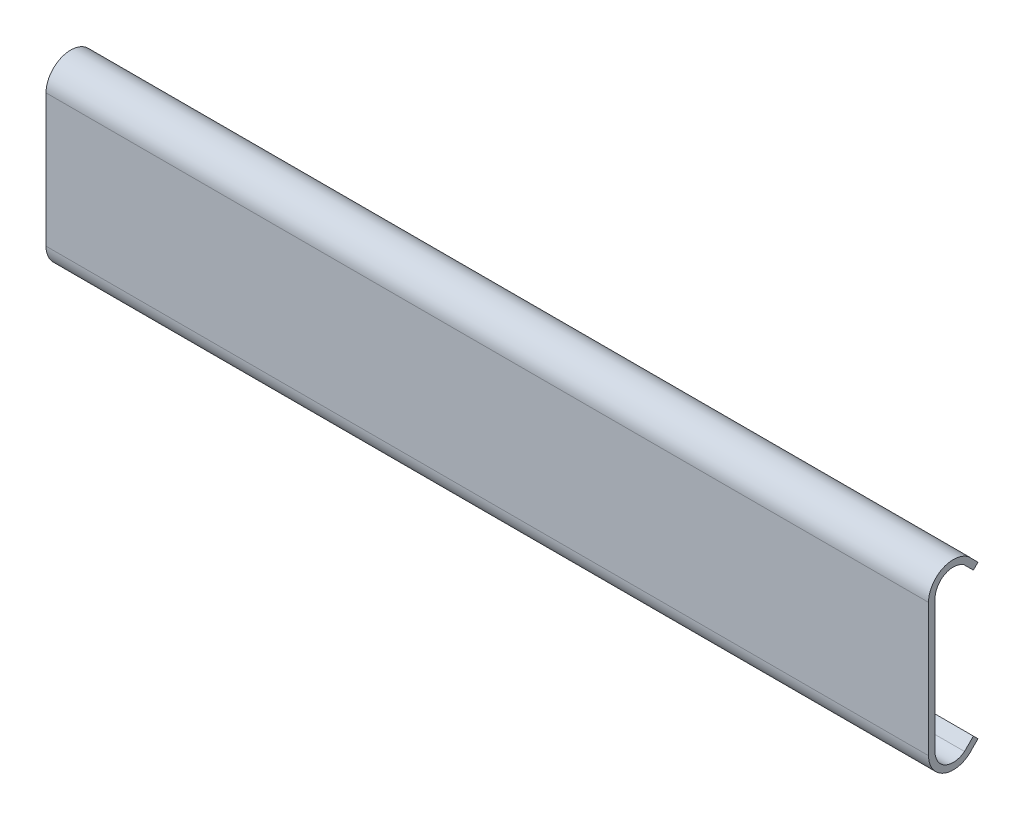
ISO-10303-21;
HEADER;
FILE_DESCRIPTION(('STEP AP214'),'2;1');
FILE_NAME('part.step','',(''),(''),'','','');
FILE_SCHEMA(('AUTOMOTIVE_DESIGN { 1 0 10303 214 1 1 1 1 }'));
ENDSEC;
DATA;
#1=APPLICATION_CONTEXT('core data for automotive mechanical design processes');
#2=APPLICATION_PROTOCOL_DEFINITION('international standard','automotive_design',2000,#1);
#3=PRODUCT_CONTEXT('',#1,'mechanical');
#4=PRODUCT('Part','Part','',(#3));
#5=PRODUCT_RELATED_PRODUCT_CATEGORY('part','',(#4));
#6=PRODUCT_DEFINITION_FORMATION('','',#4);
#7=PRODUCT_DEFINITION_CONTEXT('part definition',#1,'design');
#8=PRODUCT_DEFINITION('design','',#6,#7);
#9=PRODUCT_DEFINITION_SHAPE('','',#8);
#10=(LENGTH_UNIT() NAMED_UNIT(*) SI_UNIT(.MILLI.,.METRE.));
#11=(NAMED_UNIT(*) PLANE_ANGLE_UNIT() SI_UNIT($,.RADIAN.));
#12=(NAMED_UNIT(*) SI_UNIT($,.STERADIAN.) SOLID_ANGLE_UNIT());
#13=UNCERTAINTY_MEASURE_WITH_UNIT(LENGTH_MEASURE(1.E-05),#10,'distance_accuracy_value','');
#14=(GEOMETRIC_REPRESENTATION_CONTEXT(3) GLOBAL_UNCERTAINTY_ASSIGNED_CONTEXT((#13)) GLOBAL_UNIT_ASSIGNED_CONTEXT((#10,
#11,#12)) REPRESENTATION_CONTEXT('',''));
#15=CARTESIAN_POINT('',(0.,0.,0.));
#16=DIRECTION('',(0.,0.,1.));
#17=DIRECTION('',(1.,0.,0.));
#18=AXIS2_PLACEMENT_3D('',#15,#16,#17);
#19=CARTESIAN_POINT('',(-67.8,5.872424683223,-3.8));
#20=DIRECTION('',(0.,-0.707106781186548,-0.707106781186548));
#21=DIRECTION('',(0.,0.707106781186548,-0.707106781186548));
#22=AXIS2_PLACEMENT_3D('',#19,#20,#21);
#23=PLANE('',#22);
#24=DIRECTION('',(1.,0.,0.));
#25=VECTOR('',#24,1.);
#26=CARTESIAN_POINT('',(-67.8,5.8724246832225,-3.7999999999995));
#27=LINE('',#26,#25);
#28=CARTESIAN_POINT('',(0.,5.87242468322267,-3.79999999999967));
#29=VERTEX_POINT('',#28);
#30=CARTESIAN_POINT('',(-67.8,5.87242468322267,-3.79999999999967));
#31=VERTEX_POINT('',#30);
#32=EDGE_CURVE('E188',#29,#31,#27,.F.);
#33=ORIENTED_EDGE('',*,*,#32,.F.);
#34=DIRECTION('',(0.,0.707106781186548,-0.707106781186548));
#35=VECTOR('',#34,1.);
#36=CARTESIAN_POINT('',(0.,5.872424683223,-3.8));
#37=LINE('',#36,#35);
#38=CARTESIAN_POINT('',(0.,5.51887129262917,-3.44644660940683));
#39=VERTEX_POINT('',#38);
#40=EDGE_CURVE('E218',#29,#39,#37,.F.);
#41=ORIENTED_EDGE('',*,*,#40,.T.);
#42=DIRECTION('',(1.,0.,0.));
#43=VECTOR('',#42,1.);
#44=CARTESIAN_POINT('',(-67.8,5.518871292629,-3.446446609407));
#45=LINE('',#44,#43);
#46=CARTESIAN_POINT('',(-67.8,5.51887129262917,-3.44644660940683));
#47=VERTEX_POINT('',#46);
#48=EDGE_CURVE('E198',#47,#39,#45,.T.);
#49=ORIENTED_EDGE('',*,*,#48,.F.);
#50=DIRECTION('',(0.,0.707106781186548,-0.707106781186548));
#51=VECTOR('',#50,1.);
#52=CARTESIAN_POINT('',(-67.8,5.872424683223,-3.8));
#53=LINE('',#52,#51);
#54=EDGE_CURVE('E231',#47,#31,#53,.T.);
#55=ORIENTED_EDGE('',*,*,#54,.T.);
#56=EDGE_LOOP('',(#33,#41,#49,#55));
#57=FACE_BOUND('',#56,.T.);
#58=ADVANCED_FACE('F17',(#57),#23,.T.);
#59=CARTESIAN_POINT('',(-67.8,-5.872424683223,-3.8));
#60=DIRECTION('',(0.,0.707106781186548,-0.707106781186548));
#61=DIRECTION('',(0.,0.707106781186548,0.707106781186548));
#62=AXIS2_PLACEMENT_3D('',#59,#60,#61);
#63=PLANE('',#62);
#64=DIRECTION('',(1.,0.,0.));
#65=VECTOR('',#64,1.);
#66=CARTESIAN_POINT('',(-67.8,-5.518871292629,-3.446446609407));
#67=LINE('',#66,#65);
#68=CARTESIAN_POINT('',(0.,-5.51887129262917,-3.44644660940683));
#69=VERTEX_POINT('',#68);
#70=CARTESIAN_POINT('',(-67.8,-5.51887129262917,-3.44644660940683));
#71=VERTEX_POINT('',#70);
#72=EDGE_CURVE('E158',#69,#71,#67,.F.);
#73=ORIENTED_EDGE('',*,*,#72,.F.);
#74=DIRECTION('',(0.,0.707106781186548,0.707106781186548));
#75=VECTOR('',#74,1.);
#76=CARTESIAN_POINT('',(0.,-5.872424683223,-3.8));
#77=LINE('',#76,#75);
#78=CARTESIAN_POINT('',(0.,-5.87242468322267,-3.79999999999967));
#79=VERTEX_POINT('',#78);
#80=EDGE_CURVE('E204',#69,#79,#77,.F.);
#81=ORIENTED_EDGE('',*,*,#80,.T.);
#82=DIRECTION('',(1.,0.,0.));
#83=VECTOR('',#82,1.);
#84=CARTESIAN_POINT('',(-67.8,-5.8724246832225,-3.7999999999995));
#85=LINE('',#84,#83);
#86=CARTESIAN_POINT('',(-67.8,-5.87242468322267,-3.79999999999967));
#87=VERTEX_POINT('',#86);
#88=EDGE_CURVE('E168',#87,#79,#85,.T.);
#89=ORIENTED_EDGE('',*,*,#88,.F.);
#90=DIRECTION('',(0.,0.707106781186548,0.707106781186548));
#91=VECTOR('',#90,1.);
#92=CARTESIAN_POINT('',(-67.8,-5.872424683223,-3.8));
#93=LINE('',#92,#91);
#94=EDGE_CURVE('E213',#87,#71,#93,.T.);
#95=ORIENTED_EDGE('',*,*,#94,.T.);
#96=EDGE_LOOP('',(#73,#81,#89,#95));
#97=FACE_BOUND('',#96,.T.);
#98=ADVANCED_FACE('F330',(#97),#63,.T.);
#99=CARTESIAN_POINT('',(-67.8,6.284530895197,-2.680787006839));
#100=DIRECTION('',(0.,-0.707106781186548,0.707106781186548));
#101=DIRECTION('',(0.,-0.707106781186548,-0.707106781186548));
#102=AXIS2_PLACEMENT_3D('',#99,#100,#101);
#103=PLANE('',#102);
#104=ORIENTED_EDGE('',*,*,#48,.T.);
#105=DIRECTION('',(0.,-0.707106781186548,-0.707106781186548));
#106=VECTOR('',#105,1.);
#107=CARTESIAN_POINT('',(0.,6.284530895197,-2.680787006839));
#108=LINE('',#107,#106);
#109=CARTESIAN_POINT('',(0.,6.28453089519731,-2.68078700683914));
#110=VERTEX_POINT('',#109);
#111=EDGE_CURVE('E195',#39,#110,#108,.F.);
#112=ORIENTED_EDGE('',*,*,#111,.T.);
#113=DIRECTION('',(1.,0.,0.));
#114=VECTOR('',#113,1.);
#115=CARTESIAN_POINT('',(-67.8,6.28453089519746,-2.68078700683921));
#116=LINE('',#115,#114);
#117=CARTESIAN_POINT('',(-67.8,6.28453089519735,-2.6807870068391));
#118=VERTEX_POINT('',#117);
#119=EDGE_CURVE('E147',#118,#110,#116,.T.);
#120=ORIENTED_EDGE('',*,*,#119,.F.);
#121=DIRECTION('',(0.,-0.707106781186548,-0.707106781186548));
#122=VECTOR('',#121,1.);
#123=CARTESIAN_POINT('',(-67.8,6.284530895197,-2.680787006839));
#124=LINE('',#123,#122);
#125=EDGE_CURVE('E201',#118,#47,#124,.T.);
#126=ORIENTED_EDGE('',*,*,#125,.T.);
#127=EDGE_LOOP('',(#104,#112,#120,#126));
#128=FACE_BOUND('',#127,.T.);
#129=ADVANCED_FACE('F342',(#128),#103,.T.);
#130=CARTESIAN_POINT('',(-67.8,6.436212341611,-3.236212341611));
#131=DIRECTION('',(0.,0.707106781186548,-0.707106781186548));
#132=DIRECTION('',(0.,0.707106781186548,0.707106781186548));
#133=AXIS2_PLACEMENT_3D('',#130,#131,#132);
#134=PLANE('',#133);
#135=DIRECTION('',(1.,0.,0.));
#136=VECTOR('',#135,1.);
#137=CARTESIAN_POINT('',(-67.8,6.436212341611,-3.236212341611));
#138=LINE('',#137,#136);
#139=CARTESIAN_POINT('',(0.,6.436212341611,-3.236212341611));
#140=VERTEX_POINT('',#139);
#141=CARTESIAN_POINT('',(-67.8,6.436212341611,-3.236212341611));
#142=VERTEX_POINT('',#141);
#143=EDGE_CURVE('E141',#140,#142,#138,.F.);
#144=ORIENTED_EDGE('',*,*,#143,.F.);
#145=DIRECTION('',(0.,0.707106781186548,0.707106781186548));
#146=VECTOR('',#145,1.);
#147=CARTESIAN_POINT('',(0.,6.436212341611,-3.236212341611));
#148=LINE('',#147,#146);
#149=EDGE_CURVE('E169',#140,#29,#148,.F.);
#150=ORIENTED_EDGE('',*,*,#149,.T.);
#151=ORIENTED_EDGE('',*,*,#32,.T.);
#152=DIRECTION('',(0.,0.707106781186548,0.707106781186548));
#153=VECTOR('',#152,1.);
#154=CARTESIAN_POINT('',(-67.8,6.436212341611,-3.236212341611));
#155=LINE('',#154,#153);
#156=EDGE_CURVE('E183',#31,#142,#155,.T.);
#157=ORIENTED_EDGE('',*,*,#156,.T.);
#158=EDGE_LOOP('',(#144,#150,#151,#157));
#159=FACE_BOUND('',#158,.T.);
#160=ADVANCED_FACE('F321',(#159),#134,.T.);
#161=CARTESIAN_POINT('',(-67.8,-6.436212341611,-3.236212341611));
#162=DIRECTION('',(0.,-0.707106781186548,-0.707106781186548));
#163=DIRECTION('',(0.,0.707106781186548,-0.707106781186548));
#164=AXIS2_PLACEMENT_3D('',#161,#162,#163);
#165=PLANE('',#164);
#166=ORIENTED_EDGE('',*,*,#88,.T.);
#167=DIRECTION('',(0.,0.707106781186548,-0.707106781186548));
#168=VECTOR('',#167,1.);
#169=CARTESIAN_POINT('',(0.,-6.436212341611,-3.236212341611));
#170=LINE('',#169,#168);
#171=CARTESIAN_POINT('',(0.,-6.436212341611,-3.236212341611));
#172=VERTEX_POINT('',#171);
#173=EDGE_CURVE('E172',#79,#172,#170,.F.);
#174=ORIENTED_EDGE('',*,*,#173,.T.);
#175=DIRECTION('',(1.,0.,0.));
#176=VECTOR('',#175,1.);
#177=CARTESIAN_POINT('',(-67.8,-6.436212341611,-3.236212341611));
#178=LINE('',#177,#176);
#179=CARTESIAN_POINT('',(-67.8,-6.436212341611,-3.236212341611));
#180=VERTEX_POINT('',#179);
#181=EDGE_CURVE('E125',#180,#172,#178,.T.);
#182=ORIENTED_EDGE('',*,*,#181,.F.);
#183=DIRECTION('',(0.,0.707106781186548,-0.707106781186548));
#184=VECTOR('',#183,1.);
#185=CARTESIAN_POINT('',(-67.8,-6.436212341611,-3.236212341611));
#186=LINE('',#185,#184);
#187=EDGE_CURVE('E165',#180,#87,#186,.T.);
#188=ORIENTED_EDGE('',*,*,#187,.T.);
#189=EDGE_LOOP('',(#166,#174,#182,#188));
#190=FACE_BOUND('',#189,.T.);
#191=ADVANCED_FACE('F332',(#190),#165,.T.);
#192=CARTESIAN_POINT('',(-67.8,-5.518871292629,-3.446446609407));
#193=DIRECTION('',(0.,0.707106781186548,0.707106781186548));
#194=DIRECTION('',(0.,-0.707106781186548,0.707106781186548));
#195=AXIS2_PLACEMENT_3D('',#192,#193,#194);
#196=PLANE('',#195);
#197=DIRECTION('',(-1.,0.,0.));
#198=VECTOR('',#197,1.);
#199=CARTESIAN_POINT('',(-67.8,-6.20258136753812,-2.76273653449809));
#200=LINE('',#199,#198);
#201=CARTESIAN_POINT('',(-67.8,-6.20258136753849,-2.76273653449761));
#202=VERTEX_POINT('',#201);
#203=CARTESIAN_POINT('',(0.,-6.20258136753849,-2.76273653449761));
#204=VERTEX_POINT('',#203);
#205=EDGE_CURVE('E115',#202,#204,#200,.F.);
#206=ORIENTED_EDGE('',*,*,#205,.T.);
#207=DIRECTION('',(0.,-0.707106781186548,0.707106781186548));
#208=VECTOR('',#207,1.);
#209=CARTESIAN_POINT('',(0.,-5.518871292629,-3.446446609407));
#210=LINE('',#209,#208);
#211=EDGE_CURVE('E148',#204,#69,#210,.F.);
#212=ORIENTED_EDGE('',*,*,#211,.T.);
#213=ORIENTED_EDGE('',*,*,#72,.T.);
#214=DIRECTION('',(0.,-0.707106781186548,0.707106781186548));
#215=VECTOR('',#214,1.);
#216=CARTESIAN_POINT('',(-67.8,-5.518871292629,-3.446446609407));
#217=LINE('',#216,#215);
#218=EDGE_CURVE('E156',#71,#202,#217,.T.);
#219=ORIENTED_EDGE('',*,*,#218,.T.);
#220=EDGE_LOOP('',(#206,#212,#213,#219));
#221=FACE_BOUND('',#220,.T.);
#222=ADVANCED_FACE('F293',(#221),#196,.T.);
#223=CARTESIAN_POINT('',(-67.8,6.378215491039,-2.471108709852));
#224=DIRECTION('',(0.,-0.913011065027581,0.407934792751492));
#225=DIRECTION('',(0.,-0.407934792751492,-0.913011065027581));
#226=AXIS2_PLACEMENT_3D('',#223,#224,#225);
#227=PLANE('',#226);
#228=ORIENTED_EDGE('',*,*,#119,.T.);
#229=DIRECTION('',(0.,-0.407934792751492,-0.913011065027581));
#230=VECTOR('',#229,1.);
#231=CARTESIAN_POINT('',(0.,6.378215491039,-2.471108709852));
#232=LINE('',#231,#230);
#233=CARTESIAN_POINT('',(0.,6.37821549103881,-2.47110870985204));
#234=VERTEX_POINT('',#233);
#235=EDGE_CURVE('E151',#110,#234,#232,.F.);
#236=ORIENTED_EDGE('',*,*,#235,.T.);
#237=DIRECTION('',(-1.,0.,0.));
#238=VECTOR('',#237,1.);
#239=CARTESIAN_POINT('',(-67.8,6.37821549103871,-2.47110870985187));
#240=LINE('',#239,#238);
#241=CARTESIAN_POINT('',(-67.8,6.37821549103881,-2.47110870985204));
#242=VERTEX_POINT('',#241);
#243=EDGE_CURVE('E111',#234,#242,#240,.T.);
#244=ORIENTED_EDGE('',*,*,#243,.T.);
#245=DIRECTION('',(0.,-0.407934792751492,-0.913011065027581));
#246=VECTOR('',#245,1.);
#247=CARTESIAN_POINT('',(-67.8,6.378215491039,-2.471108709852));
#248=LINE('',#247,#246);
#249=EDGE_CURVE('E144',#242,#118,#248,.T.);
#250=ORIENTED_EDGE('',*,*,#249,.T.);
#251=EDGE_LOOP('',(#228,#236,#244,#250));
#252=FACE_BOUND('',#251,.T.);
#253=ADVANCED_FACE('F340',(#252),#227,.T.);
#254=CARTESIAN_POINT('',(-67.8,6.436212341611,-3.236212341611));
#255=DIRECTION('',(0.,-0.707106781186598,-0.707106781186498));
#256=DIRECTION('',(0.,0.707106781186498,-0.707106781186598));
#257=AXIS2_PLACEMENT_3D('',#254,#255,#256);
#258=PLANE('',#257);
#259=DIRECTION('',(-1.,0.,0.));
#260=VECTOR('',#259,1.);
#261=CARTESIAN_POINT('',(-67.8,6.44350288425444,-3.24350288425444));
#262=LINE('',#261,#260);
#263=CARTESIAN_POINT('',(0.,6.44350288425444,-3.24350288425444));
#264=VERTEX_POINT('',#263);
#265=CARTESIAN_POINT('',(-67.8,6.44350288425444,-3.24350288425444));
#266=VERTEX_POINT('',#265);
#267=EDGE_CURVE('E79',#264,#266,#262,.T.);
#268=ORIENTED_EDGE('',*,*,#267,.F.);
#269=DIRECTION('',(0.,0.707106781186498,-0.707106781186598));
#270=VECTOR('',#269,1.);
#271=CARTESIAN_POINT('',(0.,6.436212341611,-3.236212341611));
#272=LINE('',#271,#270);
#273=EDGE_CURVE('E132',#264,#140,#272,.F.);
#274=ORIENTED_EDGE('',*,*,#273,.T.);
#275=ORIENTED_EDGE('',*,*,#143,.T.);
#276=DIRECTION('',(0.,0.707106781186498,-0.707106781186598));
#277=VECTOR('',#276,1.);
#278=CARTESIAN_POINT('',(-67.8,6.436212341611,-3.236212341611));
#279=LINE('',#278,#277);
#280=EDGE_CURVE('E137',#142,#266,#279,.T.);
#281=ORIENTED_EDGE('',*,*,#280,.T.);
#282=EDGE_LOOP('',(#268,#274,#275,#281));
#283=FACE_BOUND('',#282,.T.);
#284=ADVANCED_FACE('F365',(#283),#258,.T.);
#285=CARTESIAN_POINT('',(-67.8,-6.436212341611,-3.236212341611));
#286=DIRECTION('',(0.,0.707106781186598,-0.707106781186498));
#287=DIRECTION('',(0.,0.707106781186498,0.707106781186598));
#288=AXIS2_PLACEMENT_3D('',#285,#286,#287);
#289=PLANE('',#288);
#290=ORIENTED_EDGE('',*,*,#181,.T.);
#291=DIRECTION('',(0.,0.707106781186498,0.707106781186598));
#292=VECTOR('',#291,1.);
#293=CARTESIAN_POINT('',(0.,-6.436212341611,-3.236212341611));
#294=LINE('',#293,#292);
#295=CARTESIAN_POINT('',(0.,-6.44350288425444,-3.24350288425444));
#296=VERTEX_POINT('',#295);
#297=EDGE_CURVE('E118',#172,#296,#294,.F.);
#298=ORIENTED_EDGE('',*,*,#297,.T.);
#299=DIRECTION('',(-1.,0.,0.));
#300=VECTOR('',#299,1.);
#301=CARTESIAN_POINT('',(-67.8,-6.44350288425444,-3.24350288425444));
#302=LINE('',#301,#300);
#303=CARTESIAN_POINT('',(-67.8,-6.44350288425444,-3.24350288425444));
#304=VERTEX_POINT('',#303);
#305=EDGE_CURVE('E119',#304,#296,#302,.F.);
#306=ORIENTED_EDGE('',*,*,#305,.F.);
#307=DIRECTION('',(0.,0.707106781186548,0.707106781186548));
#308=VECTOR('',#307,1.);
#309=CARTESIAN_POINT('',(-67.8,-6.443502884254,-3.243502884254));
#310=LINE('',#309,#308);
#311=EDGE_CURVE('E82',#304,#180,#310,.T.);
#312=ORIENTED_EDGE('',*,*,#311,.T.);
#313=EDGE_LOOP('',(#290,#298,#306,#312));
#314=FACE_BOUND('',#313,.T.);
#315=ADVANCED_FACE('F278',(#314),#289,.T.);
#316=CARTESIAN_POINT('',(-67.8,-5.1,-1.9));
#317=DIRECTION('',(-1.,0.,0.));
#318=DIRECTION('',(0.,0.,1.));
#319=AXIS2_PLACEMENT_3D('',#316,#317,#318);
#320=CYLINDRICAL_SURFACE('',#319,1.4);
#321=ORIENTED_EDGE('',*,*,#205,.F.);
#322=CARTESIAN_POINT('',(-67.8,-5.1,-1.9));
#323=DIRECTION('',(-1.,0.,0.));
#324=DIRECTION('',(0.,0.,1.));
#325=AXIS2_PLACEMENT_3D('',#322,#323,#324);
#326=CIRCLE('',#325,1.4);
#327=CARTESIAN_POINT('',(-67.8,-5.1,-0.5));
#328=VERTEX_POINT('',#327);
#329=EDGE_CURVE('E103',#202,#328,#326,.T.);
#330=ORIENTED_EDGE('',*,*,#329,.T.);
#331=DIRECTION('',(-1.,0.,0.));
#332=VECTOR('',#331,1.);
#333=CARTESIAN_POINT('',(-67.8,-5.1,-0.5));
#334=LINE('',#333,#332);
#335=CARTESIAN_POINT('',(0.,-5.1,-0.5));
#336=VERTEX_POINT('',#335);
#337=EDGE_CURVE('E112',#336,#328,#334,.T.);
#338=ORIENTED_EDGE('',*,*,#337,.F.);
#339=CARTESIAN_POINT('',(0.,-5.1,-1.9));
#340=DIRECTION('',(-1.,0.,0.));
#341=DIRECTION('',(0.,0.,1.));
#342=AXIS2_PLACEMENT_3D('',#339,#340,#341);
#343=CIRCLE('',#342,1.4);
#344=EDGE_CURVE('E242',#204,#336,#343,.T.);
#345=ORIENTED_EDGE('',*,*,#344,.F.);
#346=EDGE_LOOP('',(#321,#330,#338,#345));
#347=FACE_BOUND('',#346,.T.);
#348=ADVANCED_FACE('F253',(#347),#320,.F.);
#349=CARTESIAN_POINT('',(-67.8,-5.1,-0.5));
#350=DIRECTION('',(0.,0.,-1.));
#351=DIRECTION('',(-1.,0.,0.));
#352=AXIS2_PLACEMENT_3D('',#349,#350,#351);
#353=PLANE('',#352);
#354=DIRECTION('',(-1.,0.,0.));
#355=VECTOR('',#354,1.);
#356=CARTESIAN_POINT('',(-67.8,5.1,-0.5));
#357=LINE('',#356,#355);
#358=CARTESIAN_POINT('',(-67.8,5.1,-0.5));
#359=VERTEX_POINT('',#358);
#360=CARTESIAN_POINT('',(0.,5.1,-0.5));
#361=VERTEX_POINT('',#360);
#362=EDGE_CURVE('E108',#359,#361,#357,.F.);
#363=ORIENTED_EDGE('',*,*,#362,.T.);
#364=DIRECTION('',(0.,1.,0.));
#365=VECTOR('',#364,1.);
#366=CARTESIAN_POINT('',(0.,5.1,-0.5));
#367=LINE('',#366,#365);
#368=EDGE_CURVE('E96',#336,#361,#367,.T.);
#369=ORIENTED_EDGE('',*,*,#368,.F.);
#370=ORIENTED_EDGE('',*,*,#337,.T.);
#371=DIRECTION('',(0.,1.,0.));
#372=VECTOR('',#371,1.);
#373=CARTESIAN_POINT('',(-67.8,5.1,-0.5));
#374=LINE('',#373,#372);
#375=EDGE_CURVE('E100',#328,#359,#374,.T.);
#376=ORIENTED_EDGE('',*,*,#375,.T.);
#377=EDGE_LOOP('',(#363,#369,#370,#376));
#378=FACE_BOUND('',#377,.T.);
#379=ADVANCED_FACE('F260',(#378),#353,.T.);
#380=CARTESIAN_POINT('',(-67.8,5.1,-1.9));
#381=DIRECTION('',(-1.,0.,0.));
#382=DIRECTION('',(0.,0.,1.));
#383=AXIS2_PLACEMENT_3D('',#380,#381,#382);
#384=CYLINDRICAL_SURFACE('',#383,1.4);
#385=ORIENTED_EDGE('',*,*,#362,.F.);
#386=CARTESIAN_POINT('',(-67.8,5.1,-1.9));
#387=DIRECTION('',(-1.,0.,0.));
#388=DIRECTION('',(0.,0.,1.));
#389=AXIS2_PLACEMENT_3D('',#386,#387,#388);
#390=CIRCLE('',#389,1.4);
#391=EDGE_CURVE('E102',#359,#242,#390,.T.);
#392=ORIENTED_EDGE('',*,*,#391,.T.);
#393=ORIENTED_EDGE('',*,*,#243,.F.);
#394=CARTESIAN_POINT('',(0.,5.1,-1.9));
#395=DIRECTION('',(-1.,0.,0.));
#396=DIRECTION('',(0.,0.,1.));
#397=AXIS2_PLACEMENT_3D('',#394,#395,#396);
#398=CIRCLE('',#397,1.4);
#399=EDGE_CURVE('E93',#361,#234,#398,.T.);
#400=ORIENTED_EDGE('',*,*,#399,.F.);
#401=EDGE_LOOP('',(#385,#392,#393,#400));
#402=FACE_BOUND('',#401,.T.);
#403=ADVANCED_FACE('F266',(#402),#384,.F.);
#404=CARTESIAN_POINT('',(-67.8,5.1,-1.9));
#405=DIRECTION('',(-1.,0.,0.));
#406=DIRECTION('',(0.,0.,1.));
#407=AXIS2_PLACEMENT_3D('',#404,#405,#406);
#408=CYLINDRICAL_SURFACE('',#407,1.9);
#409=DIRECTION('',(1.,0.,0.));
#410=VECTOR('',#409,1.);
#411=CARTESIAN_POINT('',(-67.8,5.1,0.));
#412=LINE('',#411,#410);
#413=CARTESIAN_POINT('',(0.,5.1,0.));
#414=VERTEX_POINT('',#413);
#415=CARTESIAN_POINT('',(-67.8,5.1,0.));
#416=VERTEX_POINT('',#415);
#417=EDGE_CURVE('E76',#414,#416,#412,.F.);
#418=ORIENTED_EDGE('',*,*,#417,.F.);
#419=CARTESIAN_POINT('',(0.,5.1,-1.9));
#420=DIRECTION('',(-1.,0.,0.));
#421=DIRECTION('',(0.,0.,1.));
#422=AXIS2_PLACEMENT_3D('',#419,#420,#421);
#423=CIRCLE('',#422,1.9);
#424=EDGE_CURVE('E121',#264,#414,#423,.F.);
#425=ORIENTED_EDGE('',*,*,#424,.F.);
#426=ORIENTED_EDGE('',*,*,#267,.T.);
#427=CARTESIAN_POINT('',(-67.8,5.1,-1.9));
#428=DIRECTION('',(-1.,0.,0.));
#429=DIRECTION('',(0.,0.,1.));
#430=AXIS2_PLACEMENT_3D('',#427,#428,#429);
#431=CIRCLE('',#430,1.9);
#432=EDGE_CURVE('E20',#266,#416,#431,.F.);
#433=ORIENTED_EDGE('',*,*,#432,.T.);
#434=EDGE_LOOP('',(#418,#425,#426,#433));
#435=FACE_BOUND('',#434,.T.);
#436=ADVANCED_FACE('F74',(#435),#408,.T.);
#437=CARTESIAN_POINT('',(-67.8,5.1,-1.9));
#438=DIRECTION('',(1.,0.,0.));
#439=DIRECTION('',(0.,0.,-1.));
#440=AXIS2_PLACEMENT_3D('',#437,#438,#439);
#441=PLANE('',#440);
#442=ORIENTED_EDGE('',*,*,#125,.F.);
#443=ORIENTED_EDGE('',*,*,#249,.F.);
#444=ORIENTED_EDGE('',*,*,#391,.F.);
#445=ORIENTED_EDGE('',*,*,#375,.F.);
#446=ORIENTED_EDGE('',*,*,#329,.F.);
#447=ORIENTED_EDGE('',*,*,#218,.F.);
#448=ORIENTED_EDGE('',*,*,#94,.F.);
#449=ORIENTED_EDGE('',*,*,#187,.F.);
#450=ORIENTED_EDGE('',*,*,#311,.F.);
#451=CARTESIAN_POINT('',(-67.8,-5.1,-1.9));
#452=DIRECTION('',(-1.,0.,0.));
#453=DIRECTION('',(0.,0.,1.));
#454=AXIS2_PLACEMENT_3D('',#451,#452,#453);
#455=CIRCLE('',#454,1.9);
#456=CARTESIAN_POINT('',(-67.8,-5.1,0.));
#457=VERTEX_POINT('',#456);
#458=EDGE_CURVE('E88',#457,#304,#455,.F.);
#459=ORIENTED_EDGE('',*,*,#458,.F.);
#460=DIRECTION('',(0.,1.,0.));
#461=VECTOR('',#460,1.);
#462=CARTESIAN_POINT('',(-67.8,-5.1,0.));
#463=LINE('',#462,#461);
#464=EDGE_CURVE('E84',#416,#457,#463,.F.);
#465=ORIENTED_EDGE('',*,*,#464,.F.);
#466=ORIENTED_EDGE('',*,*,#432,.F.);
#467=ORIENTED_EDGE('',*,*,#280,.F.);
#468=ORIENTED_EDGE('',*,*,#156,.F.);
#469=ORIENTED_EDGE('',*,*,#54,.F.);
#470=EDGE_LOOP('',(#442,#443,#444,#445,#446,#447,#448,#449,#450,#459,#465,#466,#467,#468,#469));
#471=FACE_BOUND('',#470,.T.);
#472=ADVANCED_FACE('F86',(#471),#441,.F.);
#473=CARTESIAN_POINT('',(-67.8,-5.1,-1.9));
#474=DIRECTION('',(-1.,0.,0.));
#475=DIRECTION('',(0.,0.,1.));
#476=AXIS2_PLACEMENT_3D('',#473,#474,#475);
#477=CYLINDRICAL_SURFACE('',#476,1.9);
#478=ORIENTED_EDGE('',*,*,#305,.T.);
#479=CARTESIAN_POINT('',(0.,-5.1,-1.9));
#480=DIRECTION('',(-1.,0.,0.));
#481=DIRECTION('',(0.,0.,1.));
#482=AXIS2_PLACEMENT_3D('',#479,#480,#481);
#483=CIRCLE('',#482,1.9);
#484=CARTESIAN_POINT('',(0.,-5.1,0.));
#485=VERTEX_POINT('',#484);
#486=EDGE_CURVE('E35',#485,#296,#483,.F.);
#487=ORIENTED_EDGE('',*,*,#486,.F.);
#488=DIRECTION('',(1.,0.,0.));
#489=VECTOR('',#488,1.);
#490=CARTESIAN_POINT('',(-67.8,-5.1,0.));
#491=LINE('',#490,#489);
#492=EDGE_CURVE('E26',#457,#485,#491,.T.);
#493=ORIENTED_EDGE('',*,*,#492,.F.);
#494=ORIENTED_EDGE('',*,*,#458,.T.);
#495=EDGE_LOOP('',(#478,#487,#493,#494));
#496=FACE_BOUND('',#495,.T.);
#497=ADVANCED_FACE('F283',(#496),#477,.T.);
#498=CARTESIAN_POINT('',(0.,5.1,-1.9));
#499=DIRECTION('',(1.,0.,0.));
#500=DIRECTION('',(0.,0.,-1.));
#501=AXIS2_PLACEMENT_3D('',#498,#499,#500);
#502=PLANE('',#501);
#503=ORIENTED_EDGE('',*,*,#40,.F.);
#504=ORIENTED_EDGE('',*,*,#149,.F.);
#505=ORIENTED_EDGE('',*,*,#273,.F.);
#506=ORIENTED_EDGE('',*,*,#424,.T.);
#507=DIRECTION('',(0.,1.,0.));
#508=VECTOR('',#507,1.);
#509=CARTESIAN_POINT('',(0.,-5.1,0.));
#510=LINE('',#509,#508);
#511=EDGE_CURVE('E11',#485,#414,#510,.T.);
#512=ORIENTED_EDGE('',*,*,#511,.F.);
#513=ORIENTED_EDGE('',*,*,#486,.T.);
#514=ORIENTED_EDGE('',*,*,#297,.F.);
#515=ORIENTED_EDGE('',*,*,#173,.F.);
#516=ORIENTED_EDGE('',*,*,#80,.F.);
#517=ORIENTED_EDGE('',*,*,#211,.F.);
#518=ORIENTED_EDGE('',*,*,#344,.T.);
#519=ORIENTED_EDGE('',*,*,#368,.T.);
#520=ORIENTED_EDGE('',*,*,#399,.T.);
#521=ORIENTED_EDGE('',*,*,#235,.F.);
#522=ORIENTED_EDGE('',*,*,#111,.F.);
#523=EDGE_LOOP('',(#503,#504,#505,#506,#512,#513,#514,#515,#516,#517,#518,#519,#520,#521,#522));
#524=FACE_BOUND('',#523,.T.);
#525=ADVANCED_FACE('F285',(#524),#502,.T.);
#526=CARTESIAN_POINT('',(-67.8,-5.1,0.));
#527=DIRECTION('',(0.,0.,1.));
#528=DIRECTION('',(1.,0.,0.));
#529=AXIS2_PLACEMENT_3D('',#526,#527,#528);
#530=PLANE('',#529);
#531=ORIENTED_EDGE('',*,*,#492,.T.);
#532=ORIENTED_EDGE('',*,*,#511,.T.);
#533=ORIENTED_EDGE('',*,*,#417,.T.);
#534=ORIENTED_EDGE('',*,*,#464,.T.);
#535=EDGE_LOOP('',(#531,#532,#533,#534));
#536=FACE_BOUND('',#535,.T.);
#537=ADVANCED_FACE('F92',(#536),#530,.T.);
#538=CLOSED_SHELL('',(#58,#98,#129,#160,#191,#222,#253,#284,#315,#348,#379,#403,#436,#472,#497,
#525,#537));
#539=MANIFOLD_SOLID_BREP('B1',#538);
#540=ADVANCED_BREP_SHAPE_REPRESENTATION('',(#18,#539),#14);
#541=SHAPE_DEFINITION_REPRESENTATION(#9,#540);
ENDSEC;
END-ISO-10303-21;
